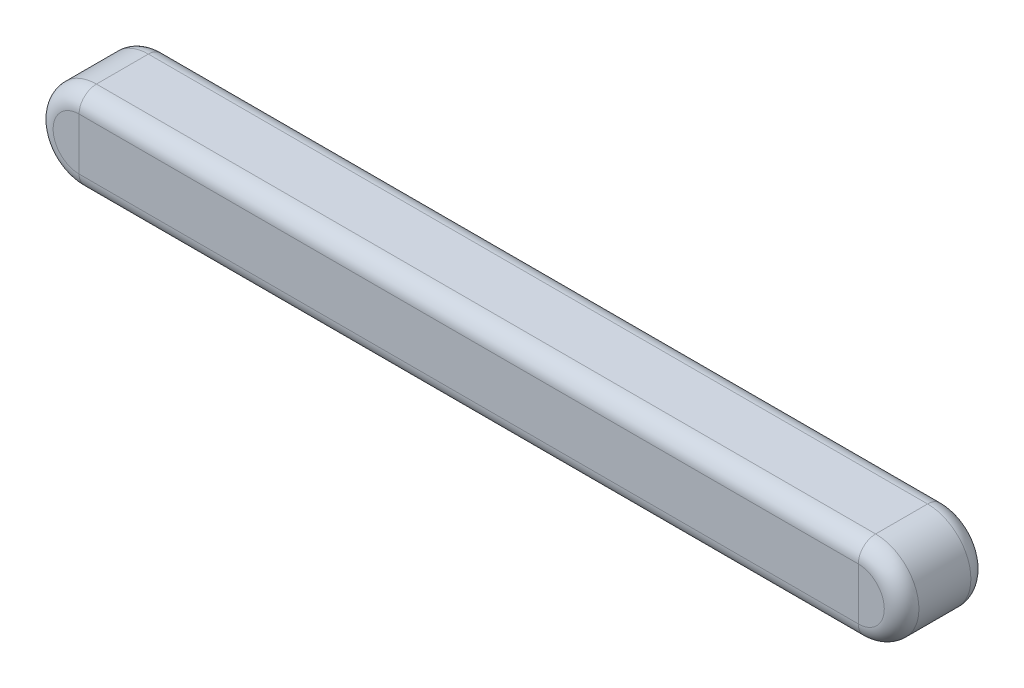
ISO-10303-21;
HEADER;
FILE_DESCRIPTION(('STEP AP214'),'2;1');
FILE_NAME('part.step','',(''),(''),'','','');
FILE_SCHEMA(('AUTOMOTIVE_DESIGN { 1 0 10303 214 1 1 1 1 }'));
ENDSEC;
DATA;
#1=APPLICATION_CONTEXT('core data for automotive mechanical design processes');
#2=APPLICATION_PROTOCOL_DEFINITION('international standard','automotive_design',2000,#1);
#3=PRODUCT_CONTEXT('',#1,'mechanical');
#4=PRODUCT('Part','Part','',(#3));
#5=PRODUCT_RELATED_PRODUCT_CATEGORY('part','',(#4));
#6=PRODUCT_DEFINITION_FORMATION('','',#4);
#7=PRODUCT_DEFINITION_CONTEXT('part definition',#1,'design');
#8=PRODUCT_DEFINITION('design','',#6,#7);
#9=PRODUCT_DEFINITION_SHAPE('','',#8);
#10=(LENGTH_UNIT() NAMED_UNIT(*) SI_UNIT(.MILLI.,.METRE.));
#11=(NAMED_UNIT(*) PLANE_ANGLE_UNIT() SI_UNIT($,.RADIAN.));
#12=(NAMED_UNIT(*) SI_UNIT($,.STERADIAN.) SOLID_ANGLE_UNIT());
#13=UNCERTAINTY_MEASURE_WITH_UNIT(LENGTH_MEASURE(1.E-05),#10,'distance_accuracy_value','');
#14=(GEOMETRIC_REPRESENTATION_CONTEXT(3) GLOBAL_UNCERTAINTY_ASSIGNED_CONTEXT((#13)) GLOBAL_UNIT_ASSIGNED_CONTEXT((#10,
#11,#12)) REPRESENTATION_CONTEXT('',''));
#15=CARTESIAN_POINT('',(0.,0.,0.));
#16=DIRECTION('',(0.,0.,1.));
#17=DIRECTION('',(1.,0.,0.));
#18=AXIS2_PLACEMENT_3D('',#15,#16,#17);
#19=CARTESIAN_POINT('',(0.,-6.35,-12.7));
#20=DIRECTION('',(0.,0.,1.));
#21=DIRECTION('',(1.,0.,0.));
#22=AXIS2_PLACEMENT_3D('',#19,#20,#21);
#23=PLANE('',#22);
#24=DIRECTION('',(0.,-1.,0.));
#25=VECTOR('',#24,1.);
#26=CARTESIAN_POINT('',(114.3,-6.35,-12.7));
#27=LINE('',#26,#25);
#28=CARTESIAN_POINT('',(114.3,-2.54,-12.7));
#29=VERTEX_POINT('',#28);
#30=CARTESIAN_POINT('',(114.3,-10.16,-12.7));
#31=VERTEX_POINT('',#30);
#32=EDGE_CURVE('E172',#29,#31,#27,.T.);
#33=ORIENTED_EDGE('',*,*,#32,.T.);
#34=DIRECTION('',(1.,0.,0.));
#35=VECTOR('',#34,1.);
#36=CARTESIAN_POINT('',(0.,-10.16,-12.7));
#37=LINE('',#36,#35);
#38=CARTESIAN_POINT('',(110.1725,-10.16,-12.7));
#39=VERTEX_POINT('',#38);
#40=EDGE_CURVE('E61',#31,#39,#37,.F.);
#41=ORIENTED_EDGE('',*,*,#40,.T.);
#42=CARTESIAN_POINT('',(107.315,-6.35,-12.7));
#43=DIRECTION('',(0.,0.,-1.));
#44=DIRECTION('',(-1.,0.,0.));
#45=AXIS2_PLACEMENT_3D('',#42,#43,#44);
#46=CIRCLE('',#45,4.7625);
#47=CARTESIAN_POINT('',(110.1725,-2.54,-12.7));
#48=VERTEX_POINT('',#47);
#49=EDGE_CURVE('E302',#48,#39,#46,.T.);
#50=ORIENTED_EDGE('',*,*,#49,.F.);
#51=DIRECTION('',(-1.,0.,0.));
#52=VECTOR('',#51,1.);
#53=CARTESIAN_POINT('',(114.3,-2.54,-12.7));
#54=LINE('',#53,#52);
#55=EDGE_CURVE('E194',#48,#29,#54,.F.);
#56=ORIENTED_EDGE('',*,*,#55,.T.);
#57=EDGE_LOOP('',(#33,#41,#50,#56));
#58=FACE_BOUND('',#57,.T.);
#59=ADVANCED_FACE('F36',(#58),#23,.F.);
#60=CARTESIAN_POINT('',(104.4575,-10.16,-12.7));
#61=VERTEX_POINT('',#60);
#62=CARTESIAN_POINT('',(104.4575,-2.54,-12.7));
#63=VERTEX_POINT('',#62);
#64=EDGE_CURVE('E300',#61,#63,#46,.T.);
#65=ORIENTED_EDGE('',*,*,#64,.F.);
#66=DIRECTION('',(1.,0.,0.));
#67=VECTOR('',#66,1.);
#68=CARTESIAN_POINT('',(0.,-10.16,-12.7));
#69=LINE('',#68,#67);
#70=CARTESIAN_POINT('',(9.84249999999999,-10.16,-12.7));
#71=VERTEX_POINT('',#70);
#72=EDGE_CURVE('E202',#61,#71,#69,.F.);
#73=ORIENTED_EDGE('',*,*,#72,.T.);
#74=CARTESIAN_POINT('',(6.985,-6.34999999999999,-12.7));
#75=DIRECTION('',(0.,0.,-1.));
#76=DIRECTION('',(-1.,0.,0.));
#77=AXIS2_PLACEMENT_3D('',#74,#75,#76);
#78=CIRCLE('',#77,4.7625);
#79=CARTESIAN_POINT('',(9.84250000000002,-2.54,-12.7));
#80=VERTEX_POINT('',#79);
#81=EDGE_CURVE('E309',#71,#80,#78,.F.);
#82=ORIENTED_EDGE('',*,*,#81,.T.);
#83=DIRECTION('',(-1.,0.,0.));
#84=VECTOR('',#83,1.);
#85=CARTESIAN_POINT('',(114.3,-2.54,-12.7));
#86=LINE('',#85,#84);
#87=EDGE_CURVE('E196',#80,#63,#86,.F.);
#88=ORIENTED_EDGE('',*,*,#87,.T.);
#89=EDGE_LOOP('',(#65,#73,#82,#88));
#90=FACE_BOUND('',#89,.T.);
#91=ADVANCED_FACE('F273',(#90),#23,.F.);
#92=CARTESIAN_POINT('',(0.,-6.35,0.));
#93=DIRECTION('',(0.,0.,1.));
#94=DIRECTION('',(1.,0.,0.));
#95=AXIS2_PLACEMENT_3D('',#92,#93,#94);
#96=PLANE('',#95);
#97=DIRECTION('',(0.,1.,0.));
#98=VECTOR('',#97,1.);
#99=CARTESIAN_POINT('',(0.,-6.35,0.));
#100=LINE('',#99,#98);
#101=CARTESIAN_POINT('',(0.,-10.16,0.));
#102=VERTEX_POINT('',#101);
#103=CARTESIAN_POINT('',(0.,-2.54,0.));
#104=VERTEX_POINT('',#103);
#105=EDGE_CURVE('E159',#102,#104,#100,.T.);
#106=ORIENTED_EDGE('',*,*,#105,.T.);
#107=CARTESIAN_POINT('',(0.,-6.35,0.));
#108=DIRECTION('',(0.,0.,1.));
#109=DIRECTION('',(1.,0.,0.));
#110=AXIS2_PLACEMENT_3D('',#107,#108,#109);
#111=CIRCLE('',#110,3.81);
#112=EDGE_CURVE('E179',#104,#102,#111,.T.);
#113=ORIENTED_EDGE('',*,*,#112,.T.);
#114=EDGE_LOOP('',(#106,#113));
#115=FACE_BOUND('',#114,.T.);
#116=ADVANCED_FACE('F236',(#115),#96,.T.);
#117=DIRECTION('',(0.,-1.,0.));
#118=VECTOR('',#117,1.);
#119=CARTESIAN_POINT('',(114.3,-6.35,0.));
#120=LINE('',#119,#118);
#121=CARTESIAN_POINT('',(114.3,-2.54,0.));
#122=VERTEX_POINT('',#121);
#123=CARTESIAN_POINT('',(114.3,-10.16,0.));
#124=VERTEX_POINT('',#123);
#125=EDGE_CURVE('E156',#122,#124,#120,.T.);
#126=ORIENTED_EDGE('',*,*,#125,.T.);
#127=CARTESIAN_POINT('',(114.3,-6.35,0.));
#128=DIRECTION('',(0.,0.,1.));
#129=DIRECTION('',(1.,0.,0.));
#130=AXIS2_PLACEMENT_3D('',#127,#128,#129);
#131=CIRCLE('',#130,3.81);
#132=EDGE_CURVE('E134',#124,#122,#131,.T.);
#133=ORIENTED_EDGE('',*,*,#132,.T.);
#134=EDGE_LOOP('',(#126,#133));
#135=FACE_BOUND('',#134,.T.);
#136=ADVANCED_FACE('F155',(#135),#96,.T.);
#137=DIRECTION('',(0.,1.,0.));
#138=VECTOR('',#137,1.);
#139=CARTESIAN_POINT('',(0.,-6.35,-12.7));
#140=LINE('',#139,#138);
#141=CARTESIAN_POINT('',(0.,-10.16,-12.7));
#142=VERTEX_POINT('',#141);
#143=CARTESIAN_POINT('',(0.,-2.54,-12.7));
#144=VERTEX_POINT('',#143);
#145=EDGE_CURVE('E164',#142,#144,#140,.T.);
#146=ORIENTED_EDGE('',*,*,#145,.F.);
#147=CARTESIAN_POINT('',(0.,-6.35,-12.7));
#148=DIRECTION('',(0.,0.,1.));
#149=DIRECTION('',(1.,0.,0.));
#150=AXIS2_PLACEMENT_3D('',#147,#148,#149);
#151=CIRCLE('',#150,3.81);
#152=EDGE_CURVE('E188',#142,#144,#151,.F.);
#153=ORIENTED_EDGE('',*,*,#152,.T.);
#154=EDGE_LOOP('',(#146,#153));
#155=FACE_BOUND('',#154,.T.);
#156=ADVANCED_FACE('F278',(#155),#23,.F.);
#157=ORIENTED_EDGE('',*,*,#32,.F.);
#158=CARTESIAN_POINT('',(114.3,-6.35,-12.7));
#159=DIRECTION('',(0.,0.,1.));
#160=DIRECTION('',(1.,0.,0.));
#161=AXIS2_PLACEMENT_3D('',#158,#159,#160);
#162=CIRCLE('',#161,3.81);
#163=EDGE_CURVE('E185',#29,#31,#162,.F.);
#164=ORIENTED_EDGE('',*,*,#163,.T.);
#165=EDGE_LOOP('',(#157,#164));
#166=FACE_BOUND('',#165,.T.);
#167=ADVANCED_FACE('F233',(#166),#23,.F.);
#168=CARTESIAN_POINT('',(0.,-6.35,-12.7));
#169=DIRECTION('',(0.,0.,1.));
#170=DIRECTION('',(1.,0.,0.));
#171=AXIS2_PLACEMENT_3D('',#168,#169,#170);
#172=CYLINDRICAL_SURFACE('',#171,6.35);
#173=DIRECTION('',(0.,0.,1.));
#174=VECTOR('',#173,1.);
#175=CARTESIAN_POINT('',(0.,-12.7,-12.7));
#176=LINE('',#175,#174);
#177=CARTESIAN_POINT('',(0.,-12.7,-10.16));
#178=VERTEX_POINT('',#177);
#179=CARTESIAN_POINT('',(0.,-12.7,-2.54));
#180=VERTEX_POINT('',#179);
#181=EDGE_CURVE('E291',#178,#180,#176,.T.);
#182=ORIENTED_EDGE('',*,*,#181,.T.);
#183=CARTESIAN_POINT('',(0.,-6.35,-2.54));
#184=DIRECTION('',(0.,0.,1.));
#185=DIRECTION('',(1.,0.,0.));
#186=AXIS2_PLACEMENT_3D('',#183,#184,#185);
#187=CIRCLE('',#186,6.35);
#188=CARTESIAN_POINT('',(0.,0.,-2.54));
#189=VERTEX_POINT('',#188);
#190=EDGE_CURVE('E183',#180,#189,#187,.F.);
#191=ORIENTED_EDGE('',*,*,#190,.T.);
#192=DIRECTION('',(0.,0.,1.));
#193=VECTOR('',#192,1.);
#194=CARTESIAN_POINT('',(0.,0.,-12.7));
#195=LINE('',#194,#193);
#196=CARTESIAN_POINT('',(0.,0.,-10.16));
#197=VERTEX_POINT('',#196);
#198=EDGE_CURVE('E284',#197,#189,#195,.T.);
#199=ORIENTED_EDGE('',*,*,#198,.F.);
#200=CARTESIAN_POINT('',(0.,-6.35,-10.16));
#201=DIRECTION('',(0.,0.,1.));
#202=DIRECTION('',(1.,0.,0.));
#203=AXIS2_PLACEMENT_3D('',#200,#201,#202);
#204=CIRCLE('',#203,6.35);
#205=EDGE_CURVE('E181',#197,#178,#204,.T.);
#206=ORIENTED_EDGE('',*,*,#205,.T.);
#207=EDGE_LOOP('',(#182,#191,#199,#206));
#208=FACE_BOUND('',#207,.T.);
#209=ADVANCED_FACE('F241',(#208),#172,.T.);
#210=CARTESIAN_POINT('',(0.,0.,-12.7));
#211=DIRECTION('',(0.,1.,0.));
#212=DIRECTION('',(0.,0.,1.));
#213=AXIS2_PLACEMENT_3D('',#210,#211,#212);
#214=PLANE('',#213);
#215=ORIENTED_EDGE('',*,*,#198,.T.);
#216=DIRECTION('',(-1.,0.,0.));
#217=VECTOR('',#216,1.);
#218=CARTESIAN_POINT('',(0.,0.,-2.54));
#219=LINE('',#218,#217);
#220=CARTESIAN_POINT('',(114.3,0.,-2.54));
#221=VERTEX_POINT('',#220);
#222=EDGE_CURVE('E11',#189,#221,#219,.F.);
#223=ORIENTED_EDGE('',*,*,#222,.T.);
#224=DIRECTION('',(0.,0.,1.));
#225=VECTOR('',#224,1.);
#226=CARTESIAN_POINT('',(114.3,0.,-12.7));
#227=LINE('',#226,#225);
#228=CARTESIAN_POINT('',(114.3,0.,-10.16));
#229=VERTEX_POINT('',#228);
#230=EDGE_CURVE('E288',#229,#221,#227,.T.);
#231=ORIENTED_EDGE('',*,*,#230,.F.);
#232=DIRECTION('',(-1.,0.,0.));
#233=VECTOR('',#232,1.);
#234=CARTESIAN_POINT('',(0.,0.,-10.16));
#235=LINE('',#234,#233);
#236=EDGE_CURVE('E45',#229,#197,#235,.T.);
#237=ORIENTED_EDGE('',*,*,#236,.T.);
#238=EDGE_LOOP('',(#215,#223,#231,#237));
#239=FACE_BOUND('',#238,.T.);
#240=ADVANCED_FACE('F237',(#239),#214,.T.);
#241=CARTESIAN_POINT('',(114.3,-6.35,-12.7));
#242=DIRECTION('',(0.,0.,1.));
#243=DIRECTION('',(1.,0.,0.));
#244=AXIS2_PLACEMENT_3D('',#241,#242,#243);
#245=CYLINDRICAL_SURFACE('',#244,6.35);
#246=ORIENTED_EDGE('',*,*,#230,.T.);
#247=CARTESIAN_POINT('',(114.3,-6.35,-2.54));
#248=DIRECTION('',(0.,0.,1.));
#249=DIRECTION('',(1.,0.,0.));
#250=AXIS2_PLACEMENT_3D('',#247,#248,#249);
#251=CIRCLE('',#250,6.35);
#252=CARTESIAN_POINT('',(114.3,-12.7,-2.54));
#253=VERTEX_POINT('',#252);
#254=EDGE_CURVE('E136',#221,#253,#251,.F.);
#255=ORIENTED_EDGE('',*,*,#254,.T.);
#256=DIRECTION('',(0.,0.,1.));
#257=VECTOR('',#256,1.);
#258=CARTESIAN_POINT('',(114.3,-12.7,-12.7));
#259=LINE('',#258,#257);
#260=CARTESIAN_POINT('',(114.3,-12.7,-10.16));
#261=VERTEX_POINT('',#260);
#262=EDGE_CURVE('E294',#261,#253,#259,.T.);
#263=ORIENTED_EDGE('',*,*,#262,.F.);
#264=CARTESIAN_POINT('',(114.3,-6.35,-10.16));
#265=DIRECTION('',(0.,0.,1.));
#266=DIRECTION('',(1.,0.,0.));
#267=AXIS2_PLACEMENT_3D('',#264,#265,#266);
#268=CIRCLE('',#267,6.35);
#269=EDGE_CURVE('E158',#261,#229,#268,.T.);
#270=ORIENTED_EDGE('',*,*,#269,.T.);
#271=EDGE_LOOP('',(#246,#255,#263,#270));
#272=FACE_BOUND('',#271,.T.);
#273=ADVANCED_FACE('F240',(#272),#245,.T.);
#274=CARTESIAN_POINT('',(0.,-12.7,-12.7));
#275=DIRECTION('',(0.,-1.,0.));
#276=DIRECTION('',(0.,0.,-1.));
#277=AXIS2_PLACEMENT_3D('',#274,#275,#276);
#278=PLANE('',#277);
#279=ORIENTED_EDGE('',*,*,#181,.F.);
#280=DIRECTION('',(1.,0.,0.));
#281=VECTOR('',#280,1.);
#282=CARTESIAN_POINT('',(114.3,-12.7,-10.16));
#283=LINE('',#282,#281);
#284=EDGE_CURVE('E192',#178,#261,#283,.T.);
#285=ORIENTED_EDGE('',*,*,#284,.T.);
#286=ORIENTED_EDGE('',*,*,#262,.T.);
#287=DIRECTION('',(1.,0.,0.));
#288=VECTOR('',#287,1.);
#289=CARTESIAN_POINT('',(0.,-12.7,-2.54));
#290=LINE('',#289,#288);
#291=EDGE_CURVE('E190',#253,#180,#290,.F.);
#292=ORIENTED_EDGE('',*,*,#291,.T.);
#293=EDGE_LOOP('',(#279,#285,#286,#292));
#294=FACE_BOUND('',#293,.T.);
#295=ADVANCED_FACE('F231',(#294),#278,.T.);
#296=CARTESIAN_POINT('',(4.12749999999999,-2.54,-12.7));
#297=VERTEX_POINT('',#296);
#298=CARTESIAN_POINT('',(4.12750000000002,-10.16,-12.7));
#299=VERTEX_POINT('',#298);
#300=EDGE_CURVE('E306',#297,#299,#78,.F.);
#301=ORIENTED_EDGE('',*,*,#300,.T.);
#302=DIRECTION('',(1.,0.,0.));
#303=VECTOR('',#302,1.);
#304=CARTESIAN_POINT('',(0.,-10.16,-12.7));
#305=LINE('',#304,#303);
#306=EDGE_CURVE('E200',#299,#142,#305,.F.);
#307=ORIENTED_EDGE('',*,*,#306,.T.);
#308=ORIENTED_EDGE('',*,*,#145,.T.);
#309=DIRECTION('',(-1.,0.,0.));
#310=VECTOR('',#309,1.);
#311=CARTESIAN_POINT('',(114.3,-2.54,-12.7));
#312=LINE('',#311,#310);
#313=EDGE_CURVE('E198',#144,#297,#312,.F.);
#314=ORIENTED_EDGE('',*,*,#313,.T.);
#315=EDGE_LOOP('',(#301,#307,#308,#314));
#316=FACE_BOUND('',#315,.T.);
#317=ADVANCED_FACE('F227',(#316),#23,.F.);
#318=ORIENTED_EDGE('',*,*,#105,.F.);
#319=DIRECTION('',(1.,0.,0.));
#320=VECTOR('',#319,1.);
#321=CARTESIAN_POINT('',(0.,-10.16,0.));
#322=LINE('',#321,#320);
#323=EDGE_CURVE('E150',#102,#124,#322,.T.);
#324=ORIENTED_EDGE('',*,*,#323,.T.);
#325=ORIENTED_EDGE('',*,*,#125,.F.);
#326=DIRECTION('',(-1.,0.,0.));
#327=VECTOR('',#326,1.);
#328=CARTESIAN_POINT('',(0.,-2.54,0.));
#329=LINE('',#328,#327);
#330=EDGE_CURVE('E142',#122,#104,#329,.T.);
#331=ORIENTED_EDGE('',*,*,#330,.T.);
#332=EDGE_LOOP('',(#318,#324,#325,#331));
#333=FACE_BOUND('',#332,.T.);
#334=ADVANCED_FACE('F161',(#333),#96,.T.);
#335=CARTESIAN_POINT('',(107.315,-6.35,-6.35));
#336=DIRECTION('',(0.,0.,-1.));
#337=DIRECTION('',(-1.,0.,0.));
#338=AXIS2_PLACEMENT_3D('',#335,#336,#337);
#339=CYLINDRICAL_SURFACE('',#338,4.7625);
#340=CARTESIAN_POINT('',(107.315,-6.35,-6.35));
#341=DIRECTION('',(0.,0.,-1.));
#342=DIRECTION('',(-1.,0.,0.));
#343=AXIS2_PLACEMENT_3D('',#340,#341,#342);
#344=CIRCLE('',#343,4.7625);
#345=CARTESIAN_POINT('',(102.5525,-6.35,-6.35));
#346=VERTEX_POINT('',#345);
#347=EDGE_CURVE('E295',#346,#346,#344,.T.);
#348=ORIENTED_EDGE('',*,*,#347,.F.);
#349=EDGE_LOOP('',(#348));
#350=FACE_BOUND('',#349,.T.);
#351=ORIENTED_EDGE('',*,*,#49,.T.);
#352=CARTESIAN_POINT('',(110.1725,-10.16,-12.7));
#353=CARTESIAN_POINT('',(110.086616293561,-10.2244228804609,-12.6999845843826));
#354=CARTESIAN_POINT('',(109.998585538061,-10.2858985327796,-12.69754982996));
#355=CARTESIAN_POINT('',(109.81876753093,-10.4026553526092,-12.689063240558));
#356=CARTESIAN_POINT('',(109.726983371316,-10.4579414840285,-12.6830143291157));
#357=CARTESIAN_POINT('',(109.539895842578,-10.5622133352905,-12.6685046484973));
#358=CARTESIAN_POINT('',(109.444586716059,-10.6111881037023,-12.6600397668128));
#359=CARTESIAN_POINT('',(109.250964534729,-10.7025751869832,-12.6418107451318));
#360=CARTESIAN_POINT('',(109.15265058025,-10.7449855128949,-12.6320462130149));
#361=CARTESIAN_POINT('',(108.935886729135,-10.8299510046634,-12.6105126048311));
#362=CARTESIAN_POINT('',(108.816935663484,-10.8712206348419,-12.5986929361707));
#363=CARTESIAN_POINT('',(108.576039255114,-10.9442384649114,-12.5762017161315));
#364=CARTESIAN_POINT('',(108.454093893966,-10.9759866061801,-12.5655301718219));
#365=CARTESIAN_POINT('',(108.208034372869,-11.0297148579297,-12.5466311953569));
#366=CARTESIAN_POINT('',(108.083923107417,-11.0517071012571,-12.5384007316186));
#367=CARTESIAN_POINT('',(107.834169487352,-11.0857948175454,-12.5253411224615));
#368=CARTESIAN_POINT('',(107.708527178903,-11.097890588157,-12.5205118747467));
#369=CARTESIAN_POINT('',(107.451591277817,-11.1123472723193,-12.5147188914954));
#370=CARTESIAN_POINT('',(107.320270922717,-11.1143037145663,-12.5139158044105));
#371=CARTESIAN_POINT('',(107.057959811027,-11.1073682623923,-12.5167151196522));
#372=CARTESIAN_POINT('',(106.926969074912,-11.098475709898,-12.5203177892213));
#373=CARTESIAN_POINT('',(106.666086223841,-11.0699122606107,-12.5314748840876));
#374=CARTESIAN_POINT('',(106.536196758493,-11.050220318447,-12.5390370241182));
#375=CARTESIAN_POINT('',(106.278698877109,-11.0002353467211,-12.5571458863585));
#376=CARTESIAN_POINT('',(106.151090392272,-10.9699426374763,-12.5676925183857));
#377=CARTESIAN_POINT('',(105.902981236572,-10.9001301750892,-12.5900420637306));
#378=CARTESIAN_POINT('',(105.782383785197,-10.860936690711,-12.601793979128));
#379=CARTESIAN_POINT('',(105.544672256147,-10.7730538065955,-12.6253262530512));
#380=CARTESIAN_POINT('',(105.427558869748,-10.7243625366874,-12.6371066167267));
#381=CARTESIAN_POINT('',(105.197814049433,-10.6178933651802,-12.6589754663113));
#382=CARTESIAN_POINT('',(105.085169965913,-10.5601438029705,-12.6690690325852));
#383=CARTESIAN_POINT('',(104.864693495491,-10.4357556064513,-12.6857656216495));
#384=CARTESIAN_POINT('',(104.756857366704,-10.3691240517679,-12.692371403879));
#385=CARTESIAN_POINT('',(104.618860409888,-10.2760438428705,-12.6974452676658));
#386=CARTESIAN_POINT('',(104.586181544967,-10.2534008194333,-12.6983868938144));
#387=CARTESIAN_POINT('',(104.521403765184,-10.2073053980598,-12.6996640867087));
#388=CARTESIAN_POINT('',(104.489304666585,-10.1838532636536,-12.6999998489221));
#389=CARTESIAN_POINT('',(104.4575,-10.16,-12.7));
#390=B_SPLINE_CURVE_WITH_KNOTS('',3,(#352,#353,#354,#355,#356,#357,#358,#359,#360,#361,#362,
#363,#364,#365,#366,#367,#368,#369,#370,#371,#372,#373,#374,#375,#376,#377,#378,#379,#380,#381,
#382,#383,#384,#385,#386,#387,#388,#389),.UNSPECIFIED.,.F.,.F.,(4,2,2,2,2,2,2,2,2,2,2,2,2,2,2,2,
2,2,4),(0.,0.321921579016245,0.643583103503057,0.965795465460491,1.28810526409608,
1.66708324255027,2.04606355426277,2.42457121960066,2.80306750035216,3.19655233507171,
3.59006103880348,3.98433933390853,4.37860571635543,4.76025615277053,5.14198181444056,
5.52253620793593,5.90278906434078,6.02208046121962,6.14133336465621),.UNSPECIFIED.);
#391=EDGE_CURVE('E53',#39,#61,#390,.T.);
#392=ORIENTED_EDGE('',*,*,#391,.T.);
#393=ORIENTED_EDGE('',*,*,#64,.T.);
#394=CARTESIAN_POINT('',(104.4575,-2.54,-12.7));
#395=CARTESIAN_POINT('',(104.543383706439,-2.4755771195391,-12.6999845843826));
#396=CARTESIAN_POINT('',(104.631414461939,-2.41410146722042,-12.69754982996));
#397=CARTESIAN_POINT('',(104.81123246907,-2.29734464739075,-12.689063240558));
#398=CARTESIAN_POINT('',(104.903016628684,-2.24205851597146,-12.6830143291157));
#399=CARTESIAN_POINT('',(105.090104157422,-2.13778666470952,-12.6685046484973));
#400=CARTESIAN_POINT('',(105.185413283941,-2.08881189629773,-12.6600397668128));
#401=CARTESIAN_POINT('',(105.379035465271,-1.99742481301677,-12.6418107451318));
#402=CARTESIAN_POINT('',(105.47734941975,-1.95501448710512,-12.6320462130149));
#403=CARTESIAN_POINT('',(105.694113270865,-1.87004899533664,-12.6105126048311));
#404=CARTESIAN_POINT('',(105.813064336516,-1.82877936515812,-12.5986929361707));
#405=CARTESIAN_POINT('',(106.053960744886,-1.7557615350886,-12.5762017161315));
#406=CARTESIAN_POINT('',(106.175906106034,-1.72401339381986,-12.5655301718219));
#407=CARTESIAN_POINT('',(106.421965627131,-1.67028514207033,-12.5466311953569));
#408=CARTESIAN_POINT('',(106.546076892583,-1.64829289874287,-12.5384007316186));
#409=CARTESIAN_POINT('',(106.795830512648,-1.61420518245459,-12.5253411224615));
#410=CARTESIAN_POINT('',(106.921472821097,-1.60210941184298,-12.5205118747467));
#411=CARTESIAN_POINT('',(107.178408722183,-1.58765272768072,-12.5147188914954));
#412=CARTESIAN_POINT('',(107.309729077283,-1.58569628543374,-12.5139158044105));
#413=CARTESIAN_POINT('',(107.572040188973,-1.59263173760767,-12.5167151196522));
#414=CARTESIAN_POINT('',(107.703030925088,-1.60152429010201,-12.5203177892213));
#415=CARTESIAN_POINT('',(107.963913776159,-1.63008773938926,-12.5314748840876));
#416=CARTESIAN_POINT('',(108.093803241507,-1.649779681553,-12.5390370241182));
#417=CARTESIAN_POINT('',(108.351301122891,-1.69976465327894,-12.5571458863585));
#418=CARTESIAN_POINT('',(108.478909607728,-1.73005736252369,-12.5676925183857));
#419=CARTESIAN_POINT('',(108.727018763428,-1.79986982491075,-12.5900420637306));
#420=CARTESIAN_POINT('',(108.847616214803,-1.83906330928905,-12.601793979128));
#421=CARTESIAN_POINT('',(109.085327743853,-1.92694619340455,-12.6253262530512));
#422=CARTESIAN_POINT('',(109.202441130252,-1.9756374633126,-12.6371066167267));
#423=CARTESIAN_POINT('',(109.432185950567,-2.08210663481979,-12.6589754663113));
#424=CARTESIAN_POINT('',(109.544830034087,-2.13985619702949,-12.6690690325852));
#425=CARTESIAN_POINT('',(109.765306504509,-2.26424439354871,-12.6857656216495));
#426=CARTESIAN_POINT('',(109.873142633296,-2.33087594823206,-12.692371403879));
#427=CARTESIAN_POINT('',(110.011139590111,-2.42395615712953,-12.6974452676658));
#428=CARTESIAN_POINT('',(110.043818455033,-2.44659918056672,-12.6983868938144));
#429=CARTESIAN_POINT('',(110.108596234816,-2.49269460194018,-12.6996640867087));
#430=CARTESIAN_POINT('',(110.140695333415,-2.51614673634642,-12.6999998489221));
#431=CARTESIAN_POINT('',(110.1725,-2.54,-12.7));
#432=B_SPLINE_CURVE_WITH_KNOTS('',3,(#394,#395,#396,#397,#398,#399,#400,#401,#402,#403,#404,
#405,#406,#407,#408,#409,#410,#411,#412,#413,#414,#415,#416,#417,#418,#419,#420,#421,#422,#423,
#424,#425,#426,#427,#428,#429,#430,#431),.UNSPECIFIED.,.F.,.F.,(4,2,2,2,2,2,2,2,2,2,2,2,2,2,2,2,
2,2,4),(0.,0.321921579016246,0.643583103503057,0.965795465460491,1.28810526409608,
1.66708324255027,2.04606355426277,2.42457121960065,2.80306750035216,3.19655233507172,
3.59006103880348,3.98433933390853,4.37860571635543,4.76025615277056,5.14198181444058,
5.52253620793593,5.90278906434078,6.0220804612196,6.14133336465622),.UNSPECIFIED.);
#433=EDGE_CURVE('E205',#63,#48,#432,.T.);
#434=ORIENTED_EDGE('',*,*,#433,.T.);
#435=EDGE_LOOP('',(#351,#392,#393,#434));
#436=FACE_BOUND('',#435,.T.);
#437=ADVANCED_FACE('F219',(#350,#436),#339,.F.);
#438=CARTESIAN_POINT('',(0.,0.,-6.35));
#439=DIRECTION('',(0.,0.,-1.));
#440=DIRECTION('',(-1.,0.,0.));
#441=AXIS2_PLACEMENT_3D('',#438,#439,#440);
#442=PLANE('',#441);
#443=ORIENTED_EDGE('',*,*,#347,.T.);
#444=EDGE_LOOP('',(#443));
#445=FACE_BOUND('',#444,.T.);
#446=ADVANCED_FACE('F224',(#445),#442,.T.);
#447=CARTESIAN_POINT('',(6.985,-6.34999999999999,-6.35));
#448=DIRECTION('',(0.,0.,-1.));
#449=DIRECTION('',(-1.,0.,0.));
#450=AXIS2_PLACEMENT_3D('',#447,#448,#449);
#451=CYLINDRICAL_SURFACE('',#450,4.7625);
#452=CARTESIAN_POINT('',(6.985,-6.34999999999999,-6.35));
#453=DIRECTION('',(0.,0.,-1.));
#454=DIRECTION('',(-1.,0.,0.));
#455=AXIS2_PLACEMENT_3D('',#452,#453,#454);
#456=CIRCLE('',#455,4.7625);
#457=CARTESIAN_POINT('',(2.22250000000001,-6.34999999999999,-6.35));
#458=VERTEX_POINT('',#457);
#459=EDGE_CURVE('E303',#458,#458,#456,.F.);
#460=ORIENTED_EDGE('',*,*,#459,.T.);
#461=EDGE_LOOP('',(#460));
#462=FACE_BOUND('',#461,.T.);
#463=ORIENTED_EDGE('',*,*,#81,.F.);
#464=CARTESIAN_POINT('',(9.84249999999999,-10.16,-12.7));
#465=CARTESIAN_POINT('',(9.75661629356141,-10.2244228804609,-12.6999845843826));
#466=CARTESIAN_POINT('',(9.66858553806128,-10.2858985327796,-12.69754982996));
#467=CARTESIAN_POINT('',(9.48876753092985,-10.4026553526093,-12.689063240558));
#468=CARTESIAN_POINT('',(9.39698337131581,-10.4579414840285,-12.6830143291157));
#469=CARTESIAN_POINT('',(9.20989584257832,-10.5622133352905,-12.6685046484973));
#470=CARTESIAN_POINT('',(9.11458671605859,-10.6111881037023,-12.6600397668128));
#471=CARTESIAN_POINT('',(8.92096453472893,-10.7025751869832,-12.6418107451318));
#472=CARTESIAN_POINT('',(8.82265058024982,-10.7449855128949,-12.6320462130149));
#473=CARTESIAN_POINT('',(8.60588672913547,-10.8299510046634,-12.6105126048311));
#474=CARTESIAN_POINT('',(8.48693566348379,-10.8712206348419,-12.5986929361707));
#475=CARTESIAN_POINT('',(8.24603925511424,-10.9442384649114,-12.5762017161316));
#476=CARTESIAN_POINT('',(8.12409389396598,-10.9759866061801,-12.5655301718219));
#477=CARTESIAN_POINT('',(7.87803437286924,-11.0297148579297,-12.5466311953569));
#478=CARTESIAN_POINT('',(7.753923107417,-11.0517071012571,-12.5384007316186));
#479=CARTESIAN_POINT('',(7.50416948735224,-11.0857948175454,-12.5253411224615));
#480=CARTESIAN_POINT('',(7.37852717890344,-11.097890588157,-12.5205118747467));
#481=CARTESIAN_POINT('',(7.12159127781659,-11.1123472723193,-12.5147188914954));
#482=CARTESIAN_POINT('',(6.99027092271723,-11.1143037145663,-12.5139158044105));
#483=CARTESIAN_POINT('',(6.72795981102655,-11.1073682623923,-12.5167151196522));
#484=CARTESIAN_POINT('',(6.59696907491207,-11.098475709898,-12.5203177892213));
#485=CARTESIAN_POINT('',(6.33608622384135,-11.0699122606107,-12.5314748840876));
#486=CARTESIAN_POINT('',(6.20619675849316,-11.050220318447,-12.5390370241182));
#487=CARTESIAN_POINT('',(5.94869887710869,-11.0002353467211,-12.5571458863585));
#488=CARTESIAN_POINT('',(5.82109039227175,-10.9699426374763,-12.5676925183857));
#489=CARTESIAN_POINT('',(5.57298123657189,-10.9001301750892,-12.5900420637306));
#490=CARTESIAN_POINT('',(5.45238378519731,-10.8609366907109,-12.601793979128));
#491=CARTESIAN_POINT('',(5.21467225614712,-10.7730538065954,-12.6253262530512));
#492=CARTESIAN_POINT('',(5.09755886974756,-10.7243625366874,-12.6371066167267));
#493=CARTESIAN_POINT('',(4.8678140494332,-10.6178933651802,-12.6589754663113));
#494=CARTESIAN_POINT('',(4.75516996591293,-10.5601438029705,-12.6690690325852));
#495=CARTESIAN_POINT('',(4.53469349549132,-10.4357556064513,-12.6857656216495));
#496=CARTESIAN_POINT('',(4.42685736670358,-10.3691240517679,-12.692371403879));
#497=CARTESIAN_POINT('',(4.28886040988848,-10.2760438428704,-12.6974452676658));
#498=CARTESIAN_POINT('',(4.25618154496732,-10.2534008194333,-12.6983868938144));
#499=CARTESIAN_POINT('',(4.19140376518439,-10.2073053980598,-12.6996640867087));
#500=CARTESIAN_POINT('',(4.15930466658462,-10.1838532636536,-12.6999998489221));
#501=CARTESIAN_POINT('',(4.12750000000002,-10.16,-12.7));
#502=B_SPLINE_CURVE_WITH_KNOTS('',3,(#464,#465,#466,#467,#468,#469,#470,#471,#472,#473,#474,
#475,#476,#477,#478,#479,#480,#481,#482,#483,#484,#485,#486,#487,#488,#489,#490,#491,#492,#493,
#494,#495,#496,#497,#498,#499,#500,#501),.UNSPECIFIED.,.F.,.F.,(4,2,2,2,2,2,2,2,2,2,2,2,2,2,2,2,
2,2,4),(0.,0.32192157901625,0.643583103503061,0.965795465460493,1.28810526409608,
1.66708324255025,2.04606355426276,2.42457121960063,2.80306750035216,3.19655233507173,
3.59006103880349,3.98433933390853,4.37860571635543,4.76025615277055,5.14198181444058,
5.52253620793593,5.90278906434079,6.02208046121961,6.14133336465618),.UNSPECIFIED.);
#503=EDGE_CURVE('E151',#71,#299,#502,.T.);
#504=ORIENTED_EDGE('',*,*,#503,.T.);
#505=ORIENTED_EDGE('',*,*,#300,.F.);
#506=CARTESIAN_POINT('',(4.12749999999999,-2.54,-12.7));
#507=CARTESIAN_POINT('',(4.21338370643857,-2.4755771195391,-12.6999845843826));
#508=CARTESIAN_POINT('',(4.3014144619387,-2.41410146722041,-12.69754982996));
#509=CARTESIAN_POINT('',(4.48123246907013,-2.29734464739075,-12.689063240558));
#510=CARTESIAN_POINT('',(4.57301662868417,-2.24205851597145,-12.6830143291157));
#511=CARTESIAN_POINT('',(4.76010415742165,-2.13778666470951,-12.6685046484973));
#512=CARTESIAN_POINT('',(4.85541328394139,-2.08881189629772,-12.6600397668128));
#513=CARTESIAN_POINT('',(5.04903546527104,-1.99742481301676,-12.6418107451318));
#514=CARTESIAN_POINT('',(5.14734941975015,-1.95501448710511,-12.6320462130149));
#515=CARTESIAN_POINT('',(5.3641132708645,-1.87004899533663,-12.6105126048311));
#516=CARTESIAN_POINT('',(5.48306433651618,-1.82877936515811,-12.5986929361707));
#517=CARTESIAN_POINT('',(5.72396074488573,-1.75576153508859,-12.5762017161315));
#518=CARTESIAN_POINT('',(5.84590610603399,-1.72401339381986,-12.5655301718219));
#519=CARTESIAN_POINT('',(6.09196562713072,-1.67028514207032,-12.5466311953569));
#520=CARTESIAN_POINT('',(6.21607689258297,-1.64829289874286,-12.5384007316186));
#521=CARTESIAN_POINT('',(6.46583051264772,-1.61420518245458,-12.5253411224615));
#522=CARTESIAN_POINT('',(6.59147282109652,-1.60210941184296,-12.5205118747467));
#523=CARTESIAN_POINT('',(6.84840872218338,-1.5876527276807,-12.5147188914954));
#524=CARTESIAN_POINT('',(6.97972907728273,-1.58569628543372,-12.5139158044104));
#525=CARTESIAN_POINT('',(7.24204018897341,-1.59263173760765,-12.5167151196522));
#526=CARTESIAN_POINT('',(7.37303092508789,-1.60152429010199,-12.5203177892213));
#527=CARTESIAN_POINT('',(7.63391377615862,-1.63008773938925,-12.5314748840876));
#528=CARTESIAN_POINT('',(7.76380324150681,-1.64977968155298,-12.5390370241181));
#529=CARTESIAN_POINT('',(8.02130112289128,-1.69976465327891,-12.5571458863585));
#530=CARTESIAN_POINT('',(8.14890960772822,-1.73005736252367,-12.5676925183857));
#531=CARTESIAN_POINT('',(8.39701876342807,-1.79986982491073,-12.5900420637306));
#532=CARTESIAN_POINT('',(8.51761621480265,-1.83906330928903,-12.601793979128));
#533=CARTESIAN_POINT('',(8.75532774385285,-1.92694619340452,-12.6253262530512));
#534=CARTESIAN_POINT('',(8.8724411302524,-1.97563746331257,-12.6371066167267));
#535=CARTESIAN_POINT('',(9.10218595056676,-2.08210663481976,-12.6589754663113));
#536=CARTESIAN_POINT('',(9.21483003408704,-2.13985619702946,-12.6690690325852));
#537=CARTESIAN_POINT('',(9.43530650450864,-2.26424439354869,-12.6857656216495));
#538=CARTESIAN_POINT('',(9.54314263329638,-2.33087594823203,-12.692371403879));
#539=CARTESIAN_POINT('',(9.68113959011149,-2.4239561571295,-12.6974452676658));
#540=CARTESIAN_POINT('',(9.71381845503267,-2.4465991805667,-12.6983868938144));
#541=CARTESIAN_POINT('',(9.77859623481563,-2.49269460194017,-12.6996640867087));
#542=CARTESIAN_POINT('',(9.81069533341541,-2.51614673634642,-12.6999998489221));
#543=CARTESIAN_POINT('',(9.84250000000002,-2.54,-12.7));
#544=B_SPLINE_CURVE_WITH_KNOTS('',3,(#506,#507,#508,#509,#510,#511,#512,#513,#514,#515,#516,
#517,#518,#519,#520,#521,#522,#523,#524,#525,#526,#527,#528,#529,#530,#531,#532,#533,#534,#535,
#536,#537,#538,#539,#540,#541,#542,#543),.UNSPECIFIED.,.F.,.F.,(4,2,2,2,2,2,2,2,2,2,2,2,2,2,2,2,
2,2,4),(0.,0.32192157901625,0.643583103503061,0.965795465460492,1.28810526409608,
1.66708324255025,2.04606355426276,2.42457121960063,2.80306750035216,3.19655233507172,
3.59006103880348,3.98433933390853,4.37860571635543,4.76025615277054,5.14198181444057,
5.52253620793592,5.90278906434077,6.02208046121964,6.14133336465626),.UNSPECIFIED.);
#545=EDGE_CURVE('E324',#297,#80,#544,.T.);
#546=ORIENTED_EDGE('',*,*,#545,.T.);
#547=EDGE_LOOP('',(#463,#504,#505,#546));
#548=FACE_BOUND('',#547,.T.);
#549=ADVANCED_FACE('F338',(#462,#548),#451,.F.);
#550=CARTESIAN_POINT('',(0.,0.,-6.35));
#551=DIRECTION('',(0.,0.,-1.));
#552=DIRECTION('',(-1.,0.,0.));
#553=AXIS2_PLACEMENT_3D('',#550,#551,#552);
#554=PLANE('',#553);
#555=ORIENTED_EDGE('',*,*,#459,.F.);
#556=EDGE_LOOP('',(#555));
#557=FACE_BOUND('',#556,.T.);
#558=ADVANCED_FACE('F262',(#557),#554,.T.);
#559=CARTESIAN_POINT('',(0.,-6.35,-2.54));
#560=DIRECTION('',(0.,0.,1.));
#561=DIRECTION('',(1.,0.,0.));
#562=AXIS2_PLACEMENT_3D('',#559,#560,#561);
#563=TOROIDAL_SURFACE('',#562,3.81,2.54);
#564=CARTESIAN_POINT('',(0.,-2.54,-2.54));
#565=DIRECTION('',(1.,0.,0.));
#566=DIRECTION('',(0.,0.,-1.));
#567=AXIS2_PLACEMENT_3D('',#564,#565,#566);
#568=CIRCLE('',#567,2.54);
#569=EDGE_CURVE('E145',#189,#104,#568,.T.);
#570=ORIENTED_EDGE('',*,*,#569,.F.);
#571=ORIENTED_EDGE('',*,*,#190,.F.);
#572=CARTESIAN_POINT('',(0.,-10.16,-2.54));
#573=DIRECTION('',(1.,0.,0.));
#574=DIRECTION('',(0.,1.,0.));
#575=AXIS2_PLACEMENT_3D('',#572,#573,#574);
#576=CIRCLE('',#575,2.54);
#577=EDGE_CURVE('E310',#102,#180,#576,.T.);
#578=ORIENTED_EDGE('',*,*,#577,.F.);
#579=ORIENTED_EDGE('',*,*,#112,.F.);
#580=EDGE_LOOP('',(#570,#571,#578,#579));
#581=FACE_BOUND('',#580,.T.);
#582=ADVANCED_FACE('F259',(#581),#563,.T.);
#583=CARTESIAN_POINT('',(0.,-10.16,-2.54));
#584=DIRECTION('',(1.,0.,0.));
#585=DIRECTION('',(0.,0.,-1.));
#586=AXIS2_PLACEMENT_3D('',#583,#584,#585);
#587=CYLINDRICAL_SURFACE('',#586,2.54);
#588=ORIENTED_EDGE('',*,*,#577,.T.);
#589=ORIENTED_EDGE('',*,*,#291,.F.);
#590=CARTESIAN_POINT('',(114.3,-10.16,-2.54));
#591=DIRECTION('',(1.,0.,0.));
#592=DIRECTION('',(0.,0.,-1.));
#593=AXIS2_PLACEMENT_3D('',#590,#591,#592);
#594=CIRCLE('',#593,2.54);
#595=EDGE_CURVE('E139',#124,#253,#594,.T.);
#596=ORIENTED_EDGE('',*,*,#595,.F.);
#597=ORIENTED_EDGE('',*,*,#323,.F.);
#598=EDGE_LOOP('',(#588,#589,#596,#597));
#599=FACE_BOUND('',#598,.T.);
#600=ADVANCED_FACE('F256',(#599),#587,.T.);
#601=CARTESIAN_POINT('',(0.,-2.54,-2.54));
#602=DIRECTION('',(-1.,0.,0.));
#603=DIRECTION('',(0.,0.,1.));
#604=AXIS2_PLACEMENT_3D('',#601,#602,#603);
#605=CYLINDRICAL_SURFACE('',#604,2.54);
#606=ORIENTED_EDGE('',*,*,#569,.T.);
#607=ORIENTED_EDGE('',*,*,#330,.F.);
#608=CARTESIAN_POINT('',(114.3,-2.54,-2.54));
#609=DIRECTION('',(1.,0.,0.));
#610=DIRECTION('',(0.,0.,-1.));
#611=AXIS2_PLACEMENT_3D('',#608,#609,#610);
#612=CIRCLE('',#611,2.54);
#613=EDGE_CURVE('E130',#221,#122,#612,.T.);
#614=ORIENTED_EDGE('',*,*,#613,.F.);
#615=ORIENTED_EDGE('',*,*,#222,.F.);
#616=EDGE_LOOP('',(#606,#607,#614,#615));
#617=FACE_BOUND('',#616,.T.);
#618=ADVANCED_FACE('F143',(#617),#605,.T.);
#619=CARTESIAN_POINT('',(114.3,-6.35,-2.54));
#620=DIRECTION('',(0.,0.,1.));
#621=DIRECTION('',(1.,0.,0.));
#622=AXIS2_PLACEMENT_3D('',#619,#620,#621);
#623=TOROIDAL_SURFACE('',#622,3.81,2.54);
#624=ORIENTED_EDGE('',*,*,#595,.T.);
#625=ORIENTED_EDGE('',*,*,#254,.F.);
#626=ORIENTED_EDGE('',*,*,#613,.T.);
#627=ORIENTED_EDGE('',*,*,#132,.F.);
#628=EDGE_LOOP('',(#624,#625,#626,#627));
#629=FACE_BOUND('',#628,.T.);
#630=ADVANCED_FACE('F132',(#629),#623,.T.);
#631=CARTESIAN_POINT('',(0.,-6.35,-10.16));
#632=DIRECTION('',(0.,0.,1.));
#633=DIRECTION('',(1.,0.,0.));
#634=AXIS2_PLACEMENT_3D('',#631,#632,#633);
#635=TOROIDAL_SURFACE('',#634,3.81,2.54);
#636=CARTESIAN_POINT('',(0.,-2.54,-10.16));
#637=DIRECTION('',(1.,0.,0.));
#638=DIRECTION('',(0.,1.,0.));
#639=AXIS2_PLACEMENT_3D('',#636,#637,#638);
#640=CIRCLE('',#639,2.54);
#641=EDGE_CURVE('E353',#144,#197,#640,.T.);
#642=ORIENTED_EDGE('',*,*,#641,.F.);
#643=ORIENTED_EDGE('',*,*,#152,.F.);
#644=CARTESIAN_POINT('',(0.,-10.16,-10.16));
#645=DIRECTION('',(1.,0.,0.));
#646=DIRECTION('',(0.,0.,-1.));
#647=AXIS2_PLACEMENT_3D('',#644,#645,#646);
#648=CIRCLE('',#647,2.54);
#649=EDGE_CURVE('E40',#178,#142,#648,.T.);
#650=ORIENTED_EDGE('',*,*,#649,.F.);
#651=ORIENTED_EDGE('',*,*,#205,.F.);
#652=EDGE_LOOP('',(#642,#643,#650,#651));
#653=FACE_BOUND('',#652,.T.);
#654=ADVANCED_FACE('F38',(#653),#635,.T.);
#655=CARTESIAN_POINT('',(0.,-10.16,-10.16));
#656=DIRECTION('',(-1.,0.,0.));
#657=DIRECTION('',(0.,0.,1.));
#658=AXIS2_PLACEMENT_3D('',#655,#656,#657);
#659=CYLINDRICAL_SURFACE('',#658,2.54);
#660=ORIENTED_EDGE('',*,*,#391,.F.);
#661=ORIENTED_EDGE('',*,*,#40,.F.);
#662=CARTESIAN_POINT('',(114.3,-10.16,-10.16));
#663=DIRECTION('',(1.,0.,0.));
#664=DIRECTION('',(0.,0.,-1.));
#665=AXIS2_PLACEMENT_3D('',#662,#663,#664);
#666=CIRCLE('',#665,2.54);
#667=EDGE_CURVE('E356',#261,#31,#666,.T.);
#668=ORIENTED_EDGE('',*,*,#667,.F.);
#669=ORIENTED_EDGE('',*,*,#284,.F.);
#670=ORIENTED_EDGE('',*,*,#649,.T.);
#671=ORIENTED_EDGE('',*,*,#306,.F.);
#672=ORIENTED_EDGE('',*,*,#503,.F.);
#673=ORIENTED_EDGE('',*,*,#72,.F.);
#674=EDGE_LOOP('',(#660,#661,#668,#669,#670,#671,#672,#673));
#675=FACE_BOUND('',#674,.T.);
#676=ADVANCED_FACE('F270',(#675),#659,.T.);
#677=CARTESIAN_POINT('',(0.,-2.54,-10.16));
#678=DIRECTION('',(1.,0.,0.));
#679=DIRECTION('',(0.,0.,-1.));
#680=AXIS2_PLACEMENT_3D('',#677,#678,#679);
#681=CYLINDRICAL_SURFACE('',#680,2.54);
#682=ORIENTED_EDGE('',*,*,#641,.T.);
#683=ORIENTED_EDGE('',*,*,#236,.F.);
#684=CARTESIAN_POINT('',(114.3,-2.54,-10.16));
#685=DIRECTION('',(1.,0.,0.));
#686=DIRECTION('',(0.,0.,-1.));
#687=AXIS2_PLACEMENT_3D('',#684,#685,#686);
#688=CIRCLE('',#687,2.54);
#689=EDGE_CURVE('E559',#29,#229,#688,.T.);
#690=ORIENTED_EDGE('',*,*,#689,.F.);
#691=ORIENTED_EDGE('',*,*,#55,.F.);
#692=ORIENTED_EDGE('',*,*,#433,.F.);
#693=ORIENTED_EDGE('',*,*,#87,.F.);
#694=ORIENTED_EDGE('',*,*,#545,.F.);
#695=ORIENTED_EDGE('',*,*,#313,.F.);
#696=EDGE_LOOP('',(#682,#683,#690,#691,#692,#693,#694,#695));
#697=FACE_BOUND('',#696,.T.);
#698=ADVANCED_FACE('F216',(#697),#681,.T.);
#699=CARTESIAN_POINT('',(114.3,-6.35,-10.16));
#700=DIRECTION('',(0.,0.,1.));
#701=DIRECTION('',(1.,0.,0.));
#702=AXIS2_PLACEMENT_3D('',#699,#700,#701);
#703=TOROIDAL_SURFACE('',#702,3.81,2.54);
#704=ORIENTED_EDGE('',*,*,#667,.T.);
#705=ORIENTED_EDGE('',*,*,#163,.F.);
#706=ORIENTED_EDGE('',*,*,#689,.T.);
#707=ORIENTED_EDGE('',*,*,#269,.F.);
#708=EDGE_LOOP('',(#704,#705,#706,#707));
#709=FACE_BOUND('',#708,.T.);
#710=ADVANCED_FACE('F264',(#709),#703,.T.);
#711=CLOSED_SHELL('',(#59,#91,#116,#136,#156,#167,#209,#240,#273,#295,#317,#334,#437,#446,#549,
#558,#582,#600,#618,#630,#654,#676,#698,#710));
#712=MANIFOLD_SOLID_BREP('B2',#711);
#713=ADVANCED_BREP_SHAPE_REPRESENTATION('',(#18,#712),#14);
#714=SHAPE_DEFINITION_REPRESENTATION(#9,#713);
ENDSEC;
END-ISO-10303-21;
